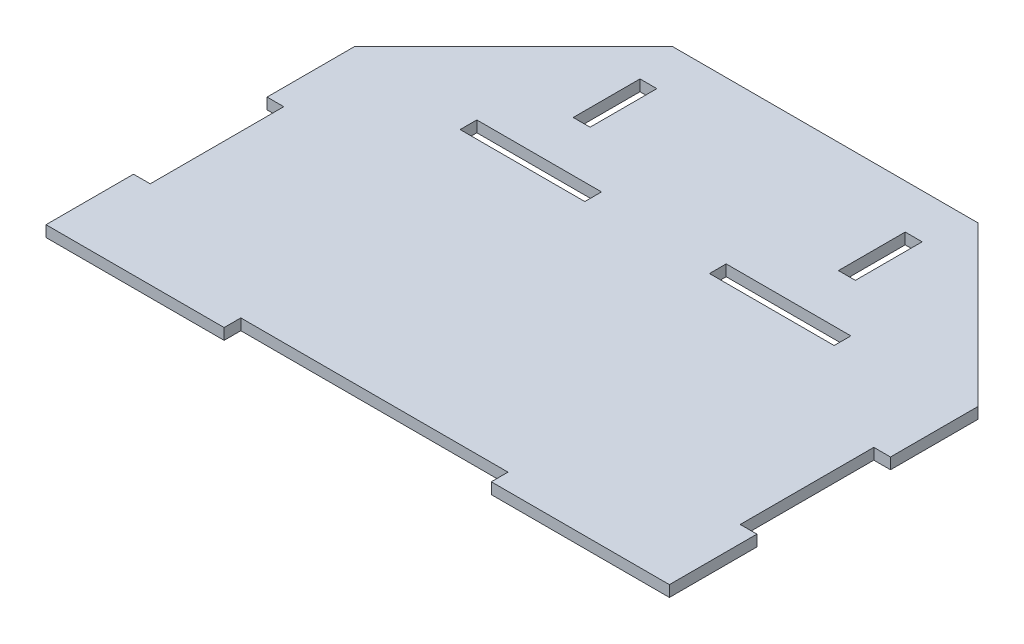
ISO-10303-21;
HEADER;
FILE_DESCRIPTION(('STEP AP214'),'2;1');
FILE_NAME('part.step','',(''),(''),'','','');
FILE_SCHEMA(('AUTOMOTIVE_DESIGN { 1 0 10303 214 1 1 1 1 }'));
ENDSEC;
DATA;
#1=APPLICATION_CONTEXT('core data for automotive mechanical design processes');
#2=APPLICATION_PROTOCOL_DEFINITION('international standard','automotive_design',2000,#1);
#3=PRODUCT_CONTEXT('',#1,'mechanical');
#4=PRODUCT('Part','Part','',(#3));
#5=PRODUCT_RELATED_PRODUCT_CATEGORY('part','',(#4));
#6=PRODUCT_DEFINITION_FORMATION('','',#4);
#7=PRODUCT_DEFINITION_CONTEXT('part definition',#1,'design');
#8=PRODUCT_DEFINITION('design','',#6,#7);
#9=PRODUCT_DEFINITION_SHAPE('','',#8);
#10=(LENGTH_UNIT() NAMED_UNIT(*) SI_UNIT(.MILLI.,.METRE.));
#11=(NAMED_UNIT(*) PLANE_ANGLE_UNIT() SI_UNIT($,.RADIAN.));
#12=(NAMED_UNIT(*) SI_UNIT($,.STERADIAN.) SOLID_ANGLE_UNIT());
#13=UNCERTAINTY_MEASURE_WITH_UNIT(LENGTH_MEASURE(1.E-05),#10,'distance_accuracy_value','');
#14=(GEOMETRIC_REPRESENTATION_CONTEXT(3) GLOBAL_UNCERTAINTY_ASSIGNED_CONTEXT((#13)) GLOBAL_UNIT_ASSIGNED_CONTEXT((#10,
#11,#12)) REPRESENTATION_CONTEXT('',''));
#15=CARTESIAN_POINT('',(0.,0.,0.));
#16=DIRECTION('',(0.,0.,1.));
#17=DIRECTION('',(1.,0.,0.));
#18=AXIS2_PLACEMENT_3D('',#15,#16,#17);
#19=CARTESIAN_POINT('',(-177.8,6.35,0.));
#20=DIRECTION('',(-1.,0.,0.));
#21=DIRECTION('',(0.,0.,1.));
#22=AXIS2_PLACEMENT_3D('',#19,#20,#21);
#23=PLANE('',#22);
#24=DIRECTION('',(0.,0.,-1.));
#25=VECTOR('',#24,1.);
#26=CARTESIAN_POINT('',(-177.8,0.,0.));
#27=LINE('',#26,#25);
#28=CARTESIAN_POINT('',(-177.8,0.,7.23900000000002));
#29=VERTEX_POINT('',#28);
#30=CARTESIAN_POINT('',(-177.8,0.,-42.672));
#31=VERTEX_POINT('',#30);
#32=EDGE_CURVE('E388',#29,#31,#27,.T.);
#33=ORIENTED_EDGE('',*,*,#32,.F.);
#34=DIRECTION('',(0.,-1.,0.));
#35=VECTOR('',#34,1.);
#36=CARTESIAN_POINT('',(-177.8,6.35,7.23900000000002));
#37=LINE('',#36,#35);
#38=CARTESIAN_POINT('',(-177.8,6.35,7.23900000000002));
#39=VERTEX_POINT('',#38);
#40=EDGE_CURVE('E11',#39,#29,#37,.T.);
#41=ORIENTED_EDGE('',*,*,#40,.F.);
#42=DIRECTION('',(0.,0.,-1.));
#43=VECTOR('',#42,1.);
#44=CARTESIAN_POINT('',(-177.8,6.35,0.));
#45=LINE('',#44,#43);
#46=CARTESIAN_POINT('',(-177.8,6.35,-42.672));
#47=VERTEX_POINT('',#46);
#48=EDGE_CURVE('E440',#39,#47,#45,.T.);
#49=ORIENTED_EDGE('',*,*,#48,.T.);
#50=DIRECTION('',(0.,-1.,0.));
#51=VECTOR('',#50,1.);
#52=CARTESIAN_POINT('',(-177.8,6.35,-42.672));
#53=LINE('',#52,#51);
#54=EDGE_CURVE('E503',#47,#31,#53,.T.);
#55=ORIENTED_EDGE('',*,*,#54,.T.);
#56=EDGE_LOOP('',(#33,#41,#49,#55));
#57=FACE_BOUND('',#56,.T.);
#58=ADVANCED_FACE('F38',(#57),#23,.T.);
#59=CARTESIAN_POINT('',(0.,6.35,7.23900000000015));
#60=DIRECTION('',(0.,0.,-1.));
#61=DIRECTION('',(-1.,0.,0.));
#62=AXIS2_PLACEMENT_3D('',#59,#60,#61);
#63=PLANE('',#62);
#64=DIRECTION('',(1.,0.,0.));
#65=VECTOR('',#64,1.);
#66=CARTESIAN_POINT('',(0.,0.,7.23900000000015));
#67=LINE('',#66,#65);
#68=CARTESIAN_POINT('',(-168.275,0.,7.23900000000003));
#69=VERTEX_POINT('',#68);
#70=EDGE_CURVE('E507',#29,#69,#67,.T.);
#71=ORIENTED_EDGE('',*,*,#70,.T.);
#72=DIRECTION('',(0.,-1.,0.));
#73=VECTOR('',#72,1.);
#74=CARTESIAN_POINT('',(-168.275,6.35,7.23900000000003));
#75=LINE('',#74,#73);
#76=CARTESIAN_POINT('',(-168.275,6.35,7.23900000000003));
#77=VERTEX_POINT('',#76);
#78=EDGE_CURVE('E46',#77,#69,#75,.T.);
#79=ORIENTED_EDGE('',*,*,#78,.F.);
#80=DIRECTION('',(1.,0.,0.));
#81=VECTOR('',#80,1.);
#82=CARTESIAN_POINT('',(0.,6.35,7.23900000000015));
#83=LINE('',#82,#81);
#84=EDGE_CURVE('E444',#39,#77,#83,.T.);
#85=ORIENTED_EDGE('',*,*,#84,.F.);
#86=ORIENTED_EDGE('',*,*,#40,.T.);
#87=EDGE_LOOP('',(#71,#79,#85,#86));
#88=FACE_BOUND('',#87,.T.);
#89=ADVANCED_FACE('F629',(#88),#63,.F.);
#90=CARTESIAN_POINT('',(-168.275,6.35,0.));
#91=DIRECTION('',(-1.,0.,0.));
#92=DIRECTION('',(0.,0.,1.));
#93=AXIS2_PLACEMENT_3D('',#90,#91,#92);
#94=PLANE('',#93);
#95=DIRECTION('',(0.,0.,-1.));
#96=VECTOR('',#95,1.);
#97=CARTESIAN_POINT('',(-168.275,0.,0.));
#98=LINE('',#97,#96);
#99=CARTESIAN_POINT('',(-168.275,0.,83.439));
#100=VERTEX_POINT('',#99);
#101=EDGE_CURVE('E511',#100,#69,#98,.T.);
#102=ORIENTED_EDGE('',*,*,#101,.F.);
#103=DIRECTION('',(0.,-1.,0.));
#104=VECTOR('',#103,1.);
#105=CARTESIAN_POINT('',(-168.275,6.35,83.439));
#106=LINE('',#105,#104);
#107=CARTESIAN_POINT('',(-168.275,6.35,83.439));
#108=VERTEX_POINT('',#107);
#109=EDGE_CURVE('E618',#108,#100,#106,.T.);
#110=ORIENTED_EDGE('',*,*,#109,.F.);
#111=DIRECTION('',(0.,0.,-1.));
#112=VECTOR('',#111,1.);
#113=CARTESIAN_POINT('',(-168.275,6.35,0.));
#114=LINE('',#113,#112);
#115=EDGE_CURVE('E448',#108,#77,#114,.T.);
#116=ORIENTED_EDGE('',*,*,#115,.T.);
#117=ORIENTED_EDGE('',*,*,#78,.T.);
#118=EDGE_LOOP('',(#102,#110,#116,#117));
#119=FACE_BOUND('',#118,.T.);
#120=ADVANCED_FACE('F624',(#119),#94,.T.);
#121=CARTESIAN_POINT('',(0.,6.35,83.439));
#122=DIRECTION('',(0.,0.,-1.));
#123=DIRECTION('',(-1.,0.,0.));
#124=AXIS2_PLACEMENT_3D('',#121,#122,#123);
#125=PLANE('',#124);
#126=DIRECTION('',(1.,0.,0.));
#127=VECTOR('',#126,1.);
#128=CARTESIAN_POINT('',(0.,0.,83.439));
#129=LINE('',#128,#127);
#130=CARTESIAN_POINT('',(-177.8,0.,83.439));
#131=VERTEX_POINT('',#130);
#132=EDGE_CURVE('E515',#131,#100,#129,.T.);
#133=ORIENTED_EDGE('',*,*,#132,.F.);
#134=DIRECTION('',(0.,-1.,0.));
#135=VECTOR('',#134,1.);
#136=CARTESIAN_POINT('',(-177.8,6.35,83.439));
#137=LINE('',#136,#135);
#138=CARTESIAN_POINT('',(-177.8,6.35,83.439));
#139=VERTEX_POINT('',#138);
#140=EDGE_CURVE('E615',#139,#131,#137,.T.);
#141=ORIENTED_EDGE('',*,*,#140,.F.);
#142=DIRECTION('',(1.,0.,0.));
#143=VECTOR('',#142,1.);
#144=CARTESIAN_POINT('',(0.,6.35,83.439));
#145=LINE('',#144,#143);
#146=EDGE_CURVE('E452',#139,#108,#145,.T.);
#147=ORIENTED_EDGE('',*,*,#146,.T.);
#148=ORIENTED_EDGE('',*,*,#109,.T.);
#149=EDGE_LOOP('',(#133,#141,#147,#148));
#150=FACE_BOUND('',#149,.T.);
#151=ADVANCED_FACE('F636',(#150),#125,.T.);
#152=CARTESIAN_POINT('',(-177.8,6.35,0.));
#153=DIRECTION('',(-1.,0.,0.));
#154=DIRECTION('',(0.,0.,1.));
#155=AXIS2_PLACEMENT_3D('',#152,#153,#154);
#156=PLANE('',#155);
#157=DIRECTION('',(0.,0.,-1.));
#158=VECTOR('',#157,1.);
#159=CARTESIAN_POINT('',(-177.8,0.,0.));
#160=LINE('',#159,#158);
#161=CARTESIAN_POINT('',(-177.8,0.,133.35));
#162=VERTEX_POINT('',#161);
#163=EDGE_CURVE('E519',#162,#131,#160,.T.);
#164=ORIENTED_EDGE('',*,*,#163,.F.);
#165=DIRECTION('',(0.,-1.,0.));
#166=VECTOR('',#165,1.);
#167=CARTESIAN_POINT('',(-177.8,6.35,133.35));
#168=LINE('',#167,#166);
#169=CARTESIAN_POINT('',(-177.8,6.35,133.35));
#170=VERTEX_POINT('',#169);
#171=EDGE_CURVE('E612',#170,#162,#168,.T.);
#172=ORIENTED_EDGE('',*,*,#171,.F.);
#173=DIRECTION('',(0.,0.,-1.));
#174=VECTOR('',#173,1.);
#175=CARTESIAN_POINT('',(-177.8,6.35,0.));
#176=LINE('',#175,#174);
#177=EDGE_CURVE('E456',#170,#139,#176,.T.);
#178=ORIENTED_EDGE('',*,*,#177,.T.);
#179=ORIENTED_EDGE('',*,*,#140,.T.);
#180=EDGE_LOOP('',(#164,#172,#178,#179));
#181=FACE_BOUND('',#180,.T.);
#182=ADVANCED_FACE('F703',(#181),#156,.T.);
#183=CARTESIAN_POINT('',(0.,6.35,133.35));
#184=DIRECTION('',(0.,0.,-1.));
#185=DIRECTION('',(-1.,0.,0.));
#186=AXIS2_PLACEMENT_3D('',#183,#184,#185);
#187=PLANE('',#186);
#188=DIRECTION('',(1.,0.,0.));
#189=VECTOR('',#188,1.);
#190=CARTESIAN_POINT('',(0.,0.,133.35));
#191=LINE('',#190,#189);
#192=CARTESIAN_POINT('',(-76.2,0.,133.35));
#193=VERTEX_POINT('',#192);
#194=EDGE_CURVE('E523',#162,#193,#191,.T.);
#195=ORIENTED_EDGE('',*,*,#194,.T.);
#196=DIRECTION('',(0.,-1.,0.));
#197=VECTOR('',#196,1.);
#198=CARTESIAN_POINT('',(-76.2,6.35,133.35));
#199=LINE('',#198,#197);
#200=CARTESIAN_POINT('',(-76.2,6.35,133.35));
#201=VERTEX_POINT('',#200);
#202=EDGE_CURVE('E608',#201,#193,#199,.T.);
#203=ORIENTED_EDGE('',*,*,#202,.F.);
#204=DIRECTION('',(1.,0.,0.));
#205=VECTOR('',#204,1.);
#206=CARTESIAN_POINT('',(0.,6.35,133.35));
#207=LINE('',#206,#205);
#208=EDGE_CURVE('E460',#170,#201,#207,.T.);
#209=ORIENTED_EDGE('',*,*,#208,.F.);
#210=ORIENTED_EDGE('',*,*,#171,.T.);
#211=EDGE_LOOP('',(#195,#203,#209,#210));
#212=FACE_BOUND('',#211,.T.);
#213=ADVANCED_FACE('F701',(#212),#187,.F.);
#214=CARTESIAN_POINT('',(-76.2,6.35,0.));
#215=DIRECTION('',(-1.,0.,0.));
#216=DIRECTION('',(0.,0.,1.));
#217=AXIS2_PLACEMENT_3D('',#214,#215,#216);
#218=PLANE('',#217);
#219=DIRECTION('',(0.,0.,-1.));
#220=VECTOR('',#219,1.);
#221=CARTESIAN_POINT('',(-76.2,0.,0.));
#222=LINE('',#221,#220);
#223=CARTESIAN_POINT('',(-76.2,0.,123.825));
#224=VERTEX_POINT('',#223);
#225=EDGE_CURVE('E526',#193,#224,#222,.T.);
#226=ORIENTED_EDGE('',*,*,#225,.T.);
#227=DIRECTION('',(0.,-1.,0.));
#228=VECTOR('',#227,1.);
#229=CARTESIAN_POINT('',(-76.2,6.35,123.825));
#230=LINE('',#229,#228);
#231=CARTESIAN_POINT('',(-76.2,6.35,123.825));
#232=VERTEX_POINT('',#231);
#233=EDGE_CURVE('E604',#232,#224,#230,.T.);
#234=ORIENTED_EDGE('',*,*,#233,.F.);
#235=DIRECTION('',(0.,0.,-1.));
#236=VECTOR('',#235,1.);
#237=CARTESIAN_POINT('',(-76.2,6.35,0.));
#238=LINE('',#237,#236);
#239=EDGE_CURVE('E463',#201,#232,#238,.T.);
#240=ORIENTED_EDGE('',*,*,#239,.F.);
#241=ORIENTED_EDGE('',*,*,#202,.T.);
#242=EDGE_LOOP('',(#226,#234,#240,#241));
#243=FACE_BOUND('',#242,.T.);
#244=ADVANCED_FACE('F696',(#243),#218,.F.);
#245=CARTESIAN_POINT('',(0.,6.35,123.825));
#246=DIRECTION('',(0.,0.,-1.));
#247=DIRECTION('',(-1.,0.,0.));
#248=AXIS2_PLACEMENT_3D('',#245,#246,#247);
#249=PLANE('',#248);
#250=DIRECTION('',(1.,0.,0.));
#251=VECTOR('',#250,1.);
#252=CARTESIAN_POINT('',(0.,0.,123.825));
#253=LINE('',#252,#251);
#254=CARTESIAN_POINT('',(76.2,0.,123.825));
#255=VERTEX_POINT('',#254);
#256=EDGE_CURVE('E529',#224,#255,#253,.T.);
#257=ORIENTED_EDGE('',*,*,#256,.T.);
#258=DIRECTION('',(0.,-1.,0.));
#259=VECTOR('',#258,1.);
#260=CARTESIAN_POINT('',(76.2,6.35,123.825));
#261=LINE('',#260,#259);
#262=CARTESIAN_POINT('',(76.2,6.35,123.825));
#263=VERTEX_POINT('',#262);
#264=EDGE_CURVE('E601',#263,#255,#261,.T.);
#265=ORIENTED_EDGE('',*,*,#264,.F.);
#266=DIRECTION('',(1.,0.,0.));
#267=VECTOR('',#266,1.);
#268=CARTESIAN_POINT('',(0.,6.35,123.825));
#269=LINE('',#268,#267);
#270=EDGE_CURVE('E466',#232,#263,#269,.T.);
#271=ORIENTED_EDGE('',*,*,#270,.F.);
#272=ORIENTED_EDGE('',*,*,#233,.T.);
#273=EDGE_LOOP('',(#257,#265,#271,#272));
#274=FACE_BOUND('',#273,.T.);
#275=ADVANCED_FACE('F692',(#274),#249,.F.);
#276=CARTESIAN_POINT('',(76.2,6.35,0.));
#277=DIRECTION('',(-1.,0.,0.));
#278=DIRECTION('',(0.,0.,1.));
#279=AXIS2_PLACEMENT_3D('',#276,#277,#278);
#280=PLANE('',#279);
#281=DIRECTION('',(0.,0.,-1.));
#282=VECTOR('',#281,1.);
#283=CARTESIAN_POINT('',(76.2,0.,0.));
#284=LINE('',#283,#282);
#285=CARTESIAN_POINT('',(76.2,0.,133.35));
#286=VERTEX_POINT('',#285);
#287=EDGE_CURVE('E533',#286,#255,#284,.T.);
#288=ORIENTED_EDGE('',*,*,#287,.F.);
#289=DIRECTION('',(0.,-1.,0.));
#290=VECTOR('',#289,1.);
#291=CARTESIAN_POINT('',(76.2,6.35,133.35));
#292=LINE('',#291,#290);
#293=CARTESIAN_POINT('',(76.2,6.35,133.35));
#294=VERTEX_POINT('',#293);
#295=EDGE_CURVE('E598',#294,#286,#292,.T.);
#296=ORIENTED_EDGE('',*,*,#295,.F.);
#297=DIRECTION('',(0.,0.,-1.));
#298=VECTOR('',#297,1.);
#299=CARTESIAN_POINT('',(76.2,6.35,0.));
#300=LINE('',#299,#298);
#301=EDGE_CURVE('E469',#294,#263,#300,.T.);
#302=ORIENTED_EDGE('',*,*,#301,.T.);
#303=ORIENTED_EDGE('',*,*,#264,.T.);
#304=EDGE_LOOP('',(#288,#296,#302,#303));
#305=FACE_BOUND('',#304,.T.);
#306=ADVANCED_FACE('F686',(#305),#280,.T.);
#307=CARTESIAN_POINT('',(0.,6.35,133.35));
#308=DIRECTION('',(0.,0.,-1.));
#309=DIRECTION('',(-1.,0.,0.));
#310=AXIS2_PLACEMENT_3D('',#307,#308,#309);
#311=PLANE('',#310);
#312=DIRECTION('',(1.,0.,0.));
#313=VECTOR('',#312,1.);
#314=CARTESIAN_POINT('',(0.,0.,133.35));
#315=LINE('',#314,#313);
#316=CARTESIAN_POINT('',(177.8,0.,133.35));
#317=VERTEX_POINT('',#316);
#318=EDGE_CURVE('E537',#286,#317,#315,.T.);
#319=ORIENTED_EDGE('',*,*,#318,.T.);
#320=DIRECTION('',(0.,-1.,0.));
#321=VECTOR('',#320,1.);
#322=CARTESIAN_POINT('',(177.8,6.35,133.35));
#323=LINE('',#322,#321);
#324=CARTESIAN_POINT('',(177.8,6.35,133.35));
#325=VERTEX_POINT('',#324);
#326=EDGE_CURVE('E594',#325,#317,#323,.T.);
#327=ORIENTED_EDGE('',*,*,#326,.F.);
#328=DIRECTION('',(1.,0.,0.));
#329=VECTOR('',#328,1.);
#330=CARTESIAN_POINT('',(0.,6.35,133.35));
#331=LINE('',#330,#329);
#332=EDGE_CURVE('E473',#294,#325,#331,.T.);
#333=ORIENTED_EDGE('',*,*,#332,.F.);
#334=ORIENTED_EDGE('',*,*,#295,.T.);
#335=EDGE_LOOP('',(#319,#327,#333,#334));
#336=FACE_BOUND('',#335,.T.);
#337=ADVANCED_FACE('F704',(#336),#311,.F.);
#338=CARTESIAN_POINT('',(177.8,6.35,0.));
#339=DIRECTION('',(-1.,0.,0.));
#340=DIRECTION('',(0.,0.,1.));
#341=AXIS2_PLACEMENT_3D('',#338,#339,#340);
#342=PLANE('',#341);
#343=DIRECTION('',(0.,0.,-1.));
#344=VECTOR('',#343,1.);
#345=CARTESIAN_POINT('',(177.8,0.,0.));
#346=LINE('',#345,#344);
#347=CARTESIAN_POINT('',(177.8,0.,83.4390000000001));
#348=VERTEX_POINT('',#347);
#349=EDGE_CURVE('E540',#317,#348,#346,.T.);
#350=ORIENTED_EDGE('',*,*,#349,.T.);
#351=DIRECTION('',(0.,-1.,0.));
#352=VECTOR('',#351,1.);
#353=CARTESIAN_POINT('',(177.8,6.35,83.4390000000001));
#354=LINE('',#353,#352);
#355=CARTESIAN_POINT('',(177.8,6.35,83.4390000000001));
#356=VERTEX_POINT('',#355);
#357=EDGE_CURVE('E590',#356,#348,#354,.T.);
#358=ORIENTED_EDGE('',*,*,#357,.F.);
#359=DIRECTION('',(0.,0.,-1.));
#360=VECTOR('',#359,1.);
#361=CARTESIAN_POINT('',(177.8,6.35,0.));
#362=LINE('',#361,#360);
#363=EDGE_CURVE('E476',#325,#356,#362,.T.);
#364=ORIENTED_EDGE('',*,*,#363,.F.);
#365=ORIENTED_EDGE('',*,*,#326,.T.);
#366=EDGE_LOOP('',(#350,#358,#364,#365));
#367=FACE_BOUND('',#366,.T.);
#368=ADVANCED_FACE('F679',(#367),#342,.F.);
#369=CARTESIAN_POINT('',(0.,6.35,83.4390000000001));
#370=DIRECTION('',(0.,0.,1.));
#371=DIRECTION('',(1.,0.,0.));
#372=AXIS2_PLACEMENT_3D('',#369,#370,#371);
#373=PLANE('',#372);
#374=DIRECTION('',(-1.,0.,0.));
#375=VECTOR('',#374,1.);
#376=CARTESIAN_POINT('',(0.,0.,83.4390000000001));
#377=LINE('',#376,#375);
#378=CARTESIAN_POINT('',(168.275,0.,83.4390000000001));
#379=VERTEX_POINT('',#378);
#380=EDGE_CURVE('E543',#348,#379,#377,.T.);
#381=ORIENTED_EDGE('',*,*,#380,.T.);
#382=DIRECTION('',(0.,-1.,0.));
#383=VECTOR('',#382,1.);
#384=CARTESIAN_POINT('',(168.275,6.35,83.4390000000001));
#385=LINE('',#384,#383);
#386=CARTESIAN_POINT('',(168.275,6.35,83.4390000000001));
#387=VERTEX_POINT('',#386);
#388=EDGE_CURVE('E586',#387,#379,#385,.T.);
#389=ORIENTED_EDGE('',*,*,#388,.F.);
#390=DIRECTION('',(-1.,0.,0.));
#391=VECTOR('',#390,1.);
#392=CARTESIAN_POINT('',(0.,6.35,83.4390000000001));
#393=LINE('',#392,#391);
#394=EDGE_CURVE('E479',#356,#387,#393,.T.);
#395=ORIENTED_EDGE('',*,*,#394,.F.);
#396=ORIENTED_EDGE('',*,*,#357,.T.);
#397=EDGE_LOOP('',(#381,#389,#395,#396));
#398=FACE_BOUND('',#397,.T.);
#399=ADVANCED_FACE('F675',(#398),#373,.F.);
#400=CARTESIAN_POINT('',(168.275,6.35,0.));
#401=DIRECTION('',(-1.,0.,0.));
#402=DIRECTION('',(0.,0.,1.));
#403=AXIS2_PLACEMENT_3D('',#400,#401,#402);
#404=PLANE('',#403);
#405=DIRECTION('',(0.,0.,-1.));
#406=VECTOR('',#405,1.);
#407=CARTESIAN_POINT('',(168.275,0.,0.));
#408=LINE('',#407,#406);
#409=CARTESIAN_POINT('',(168.275,0.,7.23900000000009));
#410=VERTEX_POINT('',#409);
#411=EDGE_CURVE('E546',#379,#410,#408,.T.);
#412=ORIENTED_EDGE('',*,*,#411,.T.);
#413=DIRECTION('',(0.,-1.,0.));
#414=VECTOR('',#413,1.);
#415=CARTESIAN_POINT('',(168.275,6.35,7.23900000000009));
#416=LINE('',#415,#414);
#417=CARTESIAN_POINT('',(168.275,6.35,7.23900000000009));
#418=VERTEX_POINT('',#417);
#419=EDGE_CURVE('E583',#418,#410,#416,.T.);
#420=ORIENTED_EDGE('',*,*,#419,.F.);
#421=DIRECTION('',(0.,0.,-1.));
#422=VECTOR('',#421,1.);
#423=CARTESIAN_POINT('',(168.275,6.35,0.));
#424=LINE('',#423,#422);
#425=EDGE_CURVE('E482',#387,#418,#424,.T.);
#426=ORIENTED_EDGE('',*,*,#425,.F.);
#427=ORIENTED_EDGE('',*,*,#388,.T.);
#428=EDGE_LOOP('',(#412,#420,#426,#427));
#429=FACE_BOUND('',#428,.T.);
#430=ADVANCED_FACE('F670',(#429),#404,.F.);
#431=CARTESIAN_POINT('',(0.,6.35,7.23900000000021));
#432=DIRECTION('',(0.,0.,1.));
#433=DIRECTION('',(1.,0.,0.));
#434=AXIS2_PLACEMENT_3D('',#431,#432,#433);
#435=PLANE('',#434);
#436=DIRECTION('',(-1.,0.,0.));
#437=VECTOR('',#436,1.);
#438=CARTESIAN_POINT('',(0.,0.,7.23900000000021));
#439=LINE('',#438,#437);
#440=CARTESIAN_POINT('',(177.8,0.,7.23900000000008));
#441=VERTEX_POINT('',#440);
#442=EDGE_CURVE('E550',#441,#410,#439,.T.);
#443=ORIENTED_EDGE('',*,*,#442,.F.);
#444=DIRECTION('',(0.,-1.,0.));
#445=VECTOR('',#444,1.);
#446=CARTESIAN_POINT('',(177.8,6.35,7.23900000000008));
#447=LINE('',#446,#445);
#448=CARTESIAN_POINT('',(177.8,6.35,7.23900000000008));
#449=VERTEX_POINT('',#448);
#450=EDGE_CURVE('E580',#449,#441,#447,.T.);
#451=ORIENTED_EDGE('',*,*,#450,.F.);
#452=DIRECTION('',(-1.,0.,0.));
#453=VECTOR('',#452,1.);
#454=CARTESIAN_POINT('',(0.,6.35,7.23900000000021));
#455=LINE('',#454,#453);
#456=EDGE_CURVE('E485',#449,#418,#455,.T.);
#457=ORIENTED_EDGE('',*,*,#456,.T.);
#458=ORIENTED_EDGE('',*,*,#419,.T.);
#459=EDGE_LOOP('',(#443,#451,#457,#458));
#460=FACE_BOUND('',#459,.T.);
#461=ADVANCED_FACE('F664',(#460),#435,.T.);
#462=CARTESIAN_POINT('',(177.8,6.35,0.));
#463=DIRECTION('',(-1.,0.,0.));
#464=DIRECTION('',(0.,0.,1.));
#465=AXIS2_PLACEMENT_3D('',#462,#463,#464);
#466=PLANE('',#465);
#467=DIRECTION('',(0.,0.,-1.));
#468=VECTOR('',#467,1.);
#469=CARTESIAN_POINT('',(177.8,0.,0.));
#470=LINE('',#469,#468);
#471=CARTESIAN_POINT('',(177.8,0.,-42.6719999999999));
#472=VERTEX_POINT('',#471);
#473=EDGE_CURVE('E554',#441,#472,#470,.T.);
#474=ORIENTED_EDGE('',*,*,#473,.T.);
#475=DIRECTION('',(0.,-1.,0.));
#476=VECTOR('',#475,1.);
#477=CARTESIAN_POINT('',(177.8,6.35,-42.6719999999999));
#478=LINE('',#477,#476);
#479=CARTESIAN_POINT('',(177.8,6.35,-42.6719999999999));
#480=VERTEX_POINT('',#479);
#481=EDGE_CURVE('E576',#480,#472,#478,.T.);
#482=ORIENTED_EDGE('',*,*,#481,.F.);
#483=DIRECTION('',(0.,0.,-1.));
#484=VECTOR('',#483,1.);
#485=CARTESIAN_POINT('',(177.8,6.35,0.));
#486=LINE('',#485,#484);
#487=EDGE_CURVE('E489',#449,#480,#486,.T.);
#488=ORIENTED_EDGE('',*,*,#487,.F.);
#489=ORIENTED_EDGE('',*,*,#450,.T.);
#490=EDGE_LOOP('',(#474,#482,#488,#489));
#491=FACE_BOUND('',#490,.T.);
#492=ADVANCED_FACE('F661',(#491),#466,.F.);
#493=CARTESIAN_POINT('',(110.236,6.35,-110.236));
#494=DIRECTION('',(-0.707106781186547,0.,0.707106781186548));
#495=DIRECTION('',(0.707106781186548,0.,0.707106781186547));
#496=AXIS2_PLACEMENT_3D('',#493,#494,#495);
#497=PLANE('',#496);
#498=DIRECTION('',(-0.707106781186548,0.,-0.707106781186547));
#499=VECTOR('',#498,1.);
#500=CARTESIAN_POINT('',(110.236,0.,-110.236));
#501=LINE('',#500,#499);
#502=CARTESIAN_POINT('',(87.122,0.,-133.35));
#503=VERTEX_POINT('',#502);
#504=EDGE_CURVE('E557',#472,#503,#501,.T.);
#505=ORIENTED_EDGE('',*,*,#504,.T.);
#506=DIRECTION('',(0.,-1.,0.));
#507=VECTOR('',#506,1.);
#508=CARTESIAN_POINT('',(87.122,6.35,-133.35));
#509=LINE('',#508,#507);
#510=CARTESIAN_POINT('',(87.122,6.35,-133.35));
#511=VERTEX_POINT('',#510);
#512=EDGE_CURVE('E573',#511,#503,#509,.T.);
#513=ORIENTED_EDGE('',*,*,#512,.F.);
#514=DIRECTION('',(-0.707106781186548,0.,-0.707106781186547));
#515=VECTOR('',#514,1.);
#516=CARTESIAN_POINT('',(110.236,6.35,-110.236));
#517=LINE('',#516,#515);
#518=EDGE_CURVE('E492',#480,#511,#517,.T.);
#519=ORIENTED_EDGE('',*,*,#518,.F.);
#520=ORIENTED_EDGE('',*,*,#481,.T.);
#521=EDGE_LOOP('',(#505,#513,#519,#520));
#522=FACE_BOUND('',#521,.T.);
#523=ADVANCED_FACE('F656',(#522),#497,.F.);
#524=CARTESIAN_POINT('',(0.,6.35,-133.35));
#525=DIRECTION('',(0.,0.,-1.));
#526=DIRECTION('',(-1.,0.,0.));
#527=AXIS2_PLACEMENT_3D('',#524,#525,#526);
#528=PLANE('',#527);
#529=DIRECTION('',(1.,0.,0.));
#530=VECTOR('',#529,1.);
#531=CARTESIAN_POINT('',(0.,0.,-133.35));
#532=LINE('',#531,#530);
#533=CARTESIAN_POINT('',(-87.122,0.,-133.35));
#534=VERTEX_POINT('',#533);
#535=EDGE_CURVE('E561',#534,#503,#532,.T.);
#536=ORIENTED_EDGE('',*,*,#535,.F.);
#537=DIRECTION('',(0.,-1.,0.));
#538=VECTOR('',#537,1.);
#539=CARTESIAN_POINT('',(-87.122,6.35,-133.35));
#540=LINE('',#539,#538);
#541=CARTESIAN_POINT('',(-87.122,6.35,-133.35));
#542=VERTEX_POINT('',#541);
#543=EDGE_CURVE('E570',#542,#534,#540,.T.);
#544=ORIENTED_EDGE('',*,*,#543,.F.);
#545=DIRECTION('',(1.,0.,0.));
#546=VECTOR('',#545,1.);
#547=CARTESIAN_POINT('',(0.,6.35,-133.35));
#548=LINE('',#547,#546);
#549=EDGE_CURVE('E495',#542,#511,#548,.T.);
#550=ORIENTED_EDGE('',*,*,#549,.T.);
#551=ORIENTED_EDGE('',*,*,#512,.T.);
#552=EDGE_LOOP('',(#536,#544,#550,#551));
#553=FACE_BOUND('',#552,.T.);
#554=ADVANCED_FACE('F650',(#553),#528,.T.);
#555=CARTESIAN_POINT('',(-110.236,6.35,-110.236));
#556=DIRECTION('',(-0.707106781186547,0.,-0.707106781186548));
#557=DIRECTION('',(-0.707106781186548,0.,0.707106781186547));
#558=AXIS2_PLACEMENT_3D('',#555,#556,#557);
#559=PLANE('',#558);
#560=DIRECTION('',(0.707106781186548,0.,-0.707106781186547));
#561=VECTOR('',#560,1.);
#562=CARTESIAN_POINT('',(-110.236,0.,-110.236));
#563=LINE('',#562,#561);
#564=EDGE_CURVE('E445',#31,#534,#563,.T.);
#565=ORIENTED_EDGE('',*,*,#564,.F.);
#566=ORIENTED_EDGE('',*,*,#54,.F.);
#567=DIRECTION('',(0.707106781186548,0.,-0.707106781186547));
#568=VECTOR('',#567,1.);
#569=CARTESIAN_POINT('',(-110.236,6.35,-110.236));
#570=LINE('',#569,#568);
#571=EDGE_CURVE('E499',#47,#542,#570,.T.);
#572=ORIENTED_EDGE('',*,*,#571,.T.);
#573=ORIENTED_EDGE('',*,*,#543,.T.);
#574=EDGE_LOOP('',(#565,#566,#572,#573));
#575=FACE_BOUND('',#574,.T.);
#576=ADVANCED_FACE('F647',(#575),#559,.T.);
#577=CARTESIAN_POINT('',(0.,6.35,0.));
#578=DIRECTION('',(0.,1.,0.));
#579=DIRECTION('',(0.,0.,1.));
#580=AXIS2_PLACEMENT_3D('',#577,#578,#579);
#581=PLANE('',#580);
#582=DIRECTION('',(0.,0.,-1.));
#583=VECTOR('',#582,1.);
#584=CARTESIAN_POINT('',(80.5288405685259,6.35,-69.977));
#585=LINE('',#584,#583);
#586=CARTESIAN_POINT('',(80.5288405685259,6.35,-69.977));
#587=VERTEX_POINT('',#586);
#588=CARTESIAN_POINT('',(80.5288405685259,6.35,-108.077));
#589=VERTEX_POINT('',#588);
#590=EDGE_CURVE('E53',#587,#589,#585,.T.);
#591=ORIENTED_EDGE('',*,*,#590,.F.);
#592=DIRECTION('',(1.,0.,0.));
#593=VECTOR('',#592,1.);
#594=CARTESIAN_POINT('',(80.5288405685259,6.35,-69.977));
#595=LINE('',#594,#593);
#596=CARTESIAN_POINT('',(70.8768405685259,6.35,-69.977));
#597=VERTEX_POINT('',#596);
#598=EDGE_CURVE('E282',#597,#587,#595,.T.);
#599=ORIENTED_EDGE('',*,*,#598,.F.);
#600=DIRECTION('',(0.,0.,1.));
#601=VECTOR('',#600,1.);
#602=CARTESIAN_POINT('',(70.8768405685259,6.35,-69.977));
#603=LINE('',#602,#601);
#604=CARTESIAN_POINT('',(70.8768405685259,6.35,-108.077));
#605=VERTEX_POINT('',#604);
#606=EDGE_CURVE('E286',#605,#597,#603,.T.);
#607=ORIENTED_EDGE('',*,*,#606,.F.);
#608=DIRECTION('',(-1.,0.,0.));
#609=VECTOR('',#608,1.);
#610=CARTESIAN_POINT('',(80.5288405685259,6.35,-108.077));
#611=LINE('',#610,#609);
#612=EDGE_CURVE('E295',#589,#605,#611,.T.);
#613=ORIENTED_EDGE('',*,*,#612,.F.);
#614=EDGE_LOOP('',(#591,#599,#607,#613));
#615=FACE_BOUND('',#614,.T.);
#616=DIRECTION('',(0.,0.,1.));
#617=VECTOR('',#616,1.);
#618=CARTESIAN_POINT('',(-80.4077259609515,6.35,-69.977));
#619=LINE('',#618,#617);
#620=CARTESIAN_POINT('',(-80.4077259609515,6.35,-108.077));
#621=VERTEX_POINT('',#620);
#622=CARTESIAN_POINT('',(-80.4077259609515,6.35,-69.977));
#623=VERTEX_POINT('',#622);
#624=EDGE_CURVE('E61',#621,#623,#619,.T.);
#625=ORIENTED_EDGE('',*,*,#624,.F.);
#626=DIRECTION('',(-1.,0.,0.));
#627=VECTOR('',#626,1.);
#628=CARTESIAN_POINT('',(-80.4077259609515,6.35,-108.077));
#629=LINE('',#628,#627);
#630=CARTESIAN_POINT('',(-70.7862581408762,6.35,-108.077));
#631=VERTEX_POINT('',#630);
#632=EDGE_CURVE('E316',#631,#621,#629,.T.);
#633=ORIENTED_EDGE('',*,*,#632,.F.);
#634=DIRECTION('',(0.,0.,-1.));
#635=VECTOR('',#634,1.);
#636=CARTESIAN_POINT('',(-70.7862581408762,6.35,-69.977));
#637=LINE('',#636,#635);
#638=CARTESIAN_POINT('',(-70.7862581408762,6.35,-69.977));
#639=VERTEX_POINT('',#638);
#640=EDGE_CURVE('E335',#639,#631,#637,.T.);
#641=ORIENTED_EDGE('',*,*,#640,.F.);
#642=DIRECTION('',(1.,0.,0.));
#643=VECTOR('',#642,1.);
#644=CARTESIAN_POINT('',(-80.4077259609515,6.35,-69.977));
#645=LINE('',#644,#643);
#646=EDGE_CURVE('E331',#623,#639,#645,.T.);
#647=ORIENTED_EDGE('',*,*,#646,.F.);
#648=EDGE_LOOP('',(#625,#633,#641,#647));
#649=FACE_BOUND('',#648,.T.);
#650=DIRECTION('',(0.,0.,-1.));
#651=VECTOR('',#650,1.);
#652=CARTESIAN_POINT('',(106.68,6.35,-41.275));
#653=LINE('',#652,#651);
#654=CARTESIAN_POINT('',(106.68,6.35,-31.75));
#655=VERTEX_POINT('',#654);
#656=CARTESIAN_POINT('',(106.68,6.35,-41.275));
#657=VERTEX_POINT('',#656);
#658=EDGE_CURVE('E370',#655,#657,#653,.T.);
#659=ORIENTED_EDGE('',*,*,#658,.F.);
#660=DIRECTION('',(1.,0.,0.));
#661=VECTOR('',#660,1.);
#662=CARTESIAN_POINT('',(106.68,6.35,-31.75));
#663=LINE('',#662,#661);
#664=CARTESIAN_POINT('',(35.56,6.35,-31.75));
#665=VERTEX_POINT('',#664);
#666=EDGE_CURVE('E357',#665,#655,#663,.T.);
#667=ORIENTED_EDGE('',*,*,#666,.F.);
#668=DIRECTION('',(0.,0.,1.));
#669=VECTOR('',#668,1.);
#670=CARTESIAN_POINT('',(35.56,6.35,-41.275));
#671=LINE('',#670,#669);
#672=CARTESIAN_POINT('',(35.56,6.35,-41.275));
#673=VERTEX_POINT('',#672);
#674=EDGE_CURVE('E378',#673,#665,#671,.T.);
#675=ORIENTED_EDGE('',*,*,#674,.F.);
#676=DIRECTION('',(-1.,0.,0.));
#677=VECTOR('',#676,1.);
#678=CARTESIAN_POINT('',(106.68,6.35,-41.275));
#679=LINE('',#678,#677);
#680=EDGE_CURVE('E373',#657,#673,#679,.T.);
#681=ORIENTED_EDGE('',*,*,#680,.F.);
#682=EDGE_LOOP('',(#659,#667,#675,#681));
#683=FACE_BOUND('',#682,.T.);
#684=DIRECTION('',(-1.,0.,0.));
#685=VECTOR('',#684,1.);
#686=CARTESIAN_POINT('',(-106.68,6.35,-41.275));
#687=LINE('',#686,#685);
#688=CARTESIAN_POINT('',(-35.56,6.35,-41.275));
#689=VERTEX_POINT('',#688);
#690=CARTESIAN_POINT('',(-106.68,6.35,-41.275));
#691=VERTEX_POINT('',#690);
#692=EDGE_CURVE('E305',#689,#691,#687,.T.);
#693=ORIENTED_EDGE('',*,*,#692,.F.);
#694=DIRECTION('',(0.,0.,-1.));
#695=VECTOR('',#694,1.);
#696=CARTESIAN_POINT('',(-35.56,6.35,-41.275));
#697=LINE('',#696,#695);
#698=CARTESIAN_POINT('',(-35.56,6.35,-31.75));
#699=VERTEX_POINT('',#698);
#700=EDGE_CURVE('E403',#699,#689,#697,.T.);
#701=ORIENTED_EDGE('',*,*,#700,.F.);
#702=DIRECTION('',(1.,0.,0.));
#703=VECTOR('',#702,1.);
#704=CARTESIAN_POINT('',(-106.68,6.35,-31.75));
#705=LINE('',#704,#703);
#706=CARTESIAN_POINT('',(-106.68,6.35,-31.75));
#707=VERTEX_POINT('',#706);
#708=EDGE_CURVE('E422',#707,#699,#705,.T.);
#709=ORIENTED_EDGE('',*,*,#708,.F.);
#710=DIRECTION('',(0.,0.,1.));
#711=VECTOR('',#710,1.);
#712=CARTESIAN_POINT('',(-106.68,6.35,-41.275));
#713=LINE('',#712,#711);
#714=EDGE_CURVE('E418',#691,#707,#713,.T.);
#715=ORIENTED_EDGE('',*,*,#714,.F.);
#716=EDGE_LOOP('',(#693,#701,#709,#715));
#717=FACE_BOUND('',#716,.T.);
#718=ORIENTED_EDGE('',*,*,#48,.F.);
#719=ORIENTED_EDGE('',*,*,#84,.T.);
#720=ORIENTED_EDGE('',*,*,#115,.F.);
#721=ORIENTED_EDGE('',*,*,#146,.F.);
#722=ORIENTED_EDGE('',*,*,#177,.F.);
#723=ORIENTED_EDGE('',*,*,#208,.T.);
#724=ORIENTED_EDGE('',*,*,#239,.T.);
#725=ORIENTED_EDGE('',*,*,#270,.T.);
#726=ORIENTED_EDGE('',*,*,#301,.F.);
#727=ORIENTED_EDGE('',*,*,#332,.T.);
#728=ORIENTED_EDGE('',*,*,#363,.T.);
#729=ORIENTED_EDGE('',*,*,#394,.T.);
#730=ORIENTED_EDGE('',*,*,#425,.T.);
#731=ORIENTED_EDGE('',*,*,#456,.F.);
#732=ORIENTED_EDGE('',*,*,#487,.T.);
#733=ORIENTED_EDGE('',*,*,#518,.T.);
#734=ORIENTED_EDGE('',*,*,#549,.F.);
#735=ORIENTED_EDGE('',*,*,#571,.F.);
#736=EDGE_LOOP('',(#718,#719,#720,#721,#722,#723,#724,#725,#726,#727,#728,#729,#730,#731,#732,
#733,#734,#735));
#737=FACE_BOUND('',#736,.T.);
#738=ADVANCED_FACE('F640',(#615,#649,#683,#717,#737),#581,.T.);
#739=CARTESIAN_POINT('',(0.,0.,0.));
#740=DIRECTION('',(0.,1.,0.));
#741=DIRECTION('',(0.,0.,1.));
#742=AXIS2_PLACEMENT_3D('',#739,#740,#741);
#743=PLANE('',#742);
#744=DIRECTION('',(1.,0.,0.));
#745=VECTOR('',#744,1.);
#746=CARTESIAN_POINT('',(80.5288405685259,0.,-69.977));
#747=LINE('',#746,#745);
#748=CARTESIAN_POINT('',(70.8768405685259,0.,-69.977));
#749=VERTEX_POINT('',#748);
#750=CARTESIAN_POINT('',(80.5288405685259,0.,-69.977));
#751=VERTEX_POINT('',#750);
#752=EDGE_CURVE('E267',#749,#751,#747,.T.);
#753=ORIENTED_EDGE('',*,*,#752,.T.);
#754=DIRECTION('',(0.,0.,-1.));
#755=VECTOR('',#754,1.);
#756=CARTESIAN_POINT('',(80.5288405685259,0.,-69.977));
#757=LINE('',#756,#755);
#758=CARTESIAN_POINT('',(80.5288405685259,0.,-108.077));
#759=VERTEX_POINT('',#758);
#760=EDGE_CURVE('E260',#751,#759,#757,.T.);
#761=ORIENTED_EDGE('',*,*,#760,.T.);
#762=DIRECTION('',(-1.,0.,0.));
#763=VECTOR('',#762,1.);
#764=CARTESIAN_POINT('',(80.5288405685259,0.,-108.077));
#765=LINE('',#764,#763);
#766=CARTESIAN_POINT('',(70.8768405685259,0.,-108.077));
#767=VERTEX_POINT('',#766);
#768=EDGE_CURVE('E271',#759,#767,#765,.T.);
#769=ORIENTED_EDGE('',*,*,#768,.T.);
#770=DIRECTION('',(0.,0.,1.));
#771=VECTOR('',#770,1.);
#772=CARTESIAN_POINT('',(70.8768405685259,0.,-69.977));
#773=LINE('',#772,#771);
#774=EDGE_CURVE('E276',#767,#749,#773,.T.);
#775=ORIENTED_EDGE('',*,*,#774,.T.);
#776=EDGE_LOOP('',(#753,#761,#769,#775));
#777=FACE_BOUND('',#776,.T.);
#778=DIRECTION('',(-1.,0.,0.));
#779=VECTOR('',#778,1.);
#780=CARTESIAN_POINT('',(-80.4077259609515,0.,-108.077));
#781=LINE('',#780,#779);
#782=CARTESIAN_POINT('',(-70.7862581408762,0.,-108.077));
#783=VERTEX_POINT('',#782);
#784=CARTESIAN_POINT('',(-80.4077259609515,0.,-108.077));
#785=VERTEX_POINT('',#784);
#786=EDGE_CURVE('E324',#783,#785,#781,.T.);
#787=ORIENTED_EDGE('',*,*,#786,.T.);
#788=DIRECTION('',(0.,0.,1.));
#789=VECTOR('',#788,1.);
#790=CARTESIAN_POINT('',(-80.4077259609515,0.,-69.977));
#791=LINE('',#790,#789);
#792=CARTESIAN_POINT('',(-80.4077259609515,0.,-69.977));
#793=VERTEX_POINT('',#792);
#794=EDGE_CURVE('E311',#785,#793,#791,.T.);
#795=ORIENTED_EDGE('',*,*,#794,.T.);
#796=DIRECTION('',(1.,0.,0.));
#797=VECTOR('',#796,1.);
#798=CARTESIAN_POINT('',(-80.4077259609515,0.,-69.977));
#799=LINE('',#798,#797);
#800=CARTESIAN_POINT('',(-70.7862581408762,0.,-69.977));
#801=VERTEX_POINT('',#800);
#802=EDGE_CURVE('E315',#793,#801,#799,.T.);
#803=ORIENTED_EDGE('',*,*,#802,.T.);
#804=DIRECTION('',(0.,0.,-1.));
#805=VECTOR('',#804,1.);
#806=CARTESIAN_POINT('',(-70.7862581408762,0.,-69.977));
#807=LINE('',#806,#805);
#808=EDGE_CURVE('E320',#801,#783,#807,.T.);
#809=ORIENTED_EDGE('',*,*,#808,.T.);
#810=EDGE_LOOP('',(#787,#795,#803,#809));
#811=FACE_BOUND('',#810,.T.);
#812=DIRECTION('',(1.,0.,0.));
#813=VECTOR('',#812,1.);
#814=CARTESIAN_POINT('',(106.68,0.,-31.75));
#815=LINE('',#814,#813);
#816=CARTESIAN_POINT('',(35.56,0.,-31.75));
#817=VERTEX_POINT('',#816);
#818=CARTESIAN_POINT('',(106.68,0.,-31.75));
#819=VERTEX_POINT('',#818);
#820=EDGE_CURVE('E365',#817,#819,#815,.T.);
#821=ORIENTED_EDGE('',*,*,#820,.T.);
#822=DIRECTION('',(0.,0.,-1.));
#823=VECTOR('',#822,1.);
#824=CARTESIAN_POINT('',(106.68,0.,-41.275));
#825=LINE('',#824,#823);
#826=CARTESIAN_POINT('',(106.68,0.,-41.275));
#827=VERTEX_POINT('',#826);
#828=EDGE_CURVE('E352',#819,#827,#825,.T.);
#829=ORIENTED_EDGE('',*,*,#828,.T.);
#830=DIRECTION('',(-1.,0.,0.));
#831=VECTOR('',#830,1.);
#832=CARTESIAN_POINT('',(106.68,0.,-41.275));
#833=LINE('',#832,#831);
#834=CARTESIAN_POINT('',(35.56,0.,-41.275));
#835=VERTEX_POINT('',#834);
#836=EDGE_CURVE('E356',#827,#835,#833,.T.);
#837=ORIENTED_EDGE('',*,*,#836,.T.);
#838=DIRECTION('',(0.,0.,1.));
#839=VECTOR('',#838,1.);
#840=CARTESIAN_POINT('',(35.56,0.,-41.275));
#841=LINE('',#840,#839);
#842=EDGE_CURVE('E361',#835,#817,#841,.T.);
#843=ORIENTED_EDGE('',*,*,#842,.T.);
#844=EDGE_LOOP('',(#821,#829,#837,#843));
#845=FACE_BOUND('',#844,.T.);
#846=DIRECTION('',(0.,0.,-1.));
#847=VECTOR('',#846,1.);
#848=CARTESIAN_POINT('',(-35.56,0.,-41.275));
#849=LINE('',#848,#847);
#850=CARTESIAN_POINT('',(-35.56,0.,-31.75));
#851=VERTEX_POINT('',#850);
#852=CARTESIAN_POINT('',(-35.56,0.,-41.275));
#853=VERTEX_POINT('',#852);
#854=EDGE_CURVE('E411',#851,#853,#849,.T.);
#855=ORIENTED_EDGE('',*,*,#854,.T.);
#856=DIRECTION('',(-1.,0.,0.));
#857=VECTOR('',#856,1.);
#858=CARTESIAN_POINT('',(-106.68,0.,-41.275));
#859=LINE('',#858,#857);
#860=CARTESIAN_POINT('',(-106.68,0.,-41.275));
#861=VERTEX_POINT('',#860);
#862=EDGE_CURVE('E398',#853,#861,#859,.T.);
#863=ORIENTED_EDGE('',*,*,#862,.T.);
#864=DIRECTION('',(0.,0.,1.));
#865=VECTOR('',#864,1.);
#866=CARTESIAN_POINT('',(-106.68,0.,-41.275));
#867=LINE('',#866,#865);
#868=CARTESIAN_POINT('',(-106.68,0.,-31.75));
#869=VERTEX_POINT('',#868);
#870=EDGE_CURVE('E402',#861,#869,#867,.T.);
#871=ORIENTED_EDGE('',*,*,#870,.T.);
#872=DIRECTION('',(1.,0.,0.));
#873=VECTOR('',#872,1.);
#874=CARTESIAN_POINT('',(-106.68,0.,-31.75));
#875=LINE('',#874,#873);
#876=EDGE_CURVE('E407',#869,#851,#875,.T.);
#877=ORIENTED_EDGE('',*,*,#876,.T.);
#878=EDGE_LOOP('',(#855,#863,#871,#877));
#879=FACE_BOUND('',#878,.T.);
#880=ORIENTED_EDGE('',*,*,#32,.T.);
#881=ORIENTED_EDGE('',*,*,#564,.T.);
#882=ORIENTED_EDGE('',*,*,#535,.T.);
#883=ORIENTED_EDGE('',*,*,#504,.F.);
#884=ORIENTED_EDGE('',*,*,#473,.F.);
#885=ORIENTED_EDGE('',*,*,#442,.T.);
#886=ORIENTED_EDGE('',*,*,#411,.F.);
#887=ORIENTED_EDGE('',*,*,#380,.F.);
#888=ORIENTED_EDGE('',*,*,#349,.F.);
#889=ORIENTED_EDGE('',*,*,#318,.F.);
#890=ORIENTED_EDGE('',*,*,#287,.T.);
#891=ORIENTED_EDGE('',*,*,#256,.F.);
#892=ORIENTED_EDGE('',*,*,#225,.F.);
#893=ORIENTED_EDGE('',*,*,#194,.F.);
#894=ORIENTED_EDGE('',*,*,#163,.T.);
#895=ORIENTED_EDGE('',*,*,#132,.T.);
#896=ORIENTED_EDGE('',*,*,#101,.T.);
#897=ORIENTED_EDGE('',*,*,#70,.F.);
#898=EDGE_LOOP('',(#880,#881,#882,#883,#884,#885,#886,#887,#888,#889,#890,#891,#892,#893,#894,
#895,#896,#897));
#899=FACE_BOUND('',#898,.T.);
#900=ADVANCED_FACE('F278',(#777,#811,#845,#879,#899),#743,.F.);
#901=CARTESIAN_POINT('',(-106.68,0.,-41.275));
#902=DIRECTION('',(0.,0.,-1.));
#903=DIRECTION('',(-1.,0.,0.));
#904=AXIS2_PLACEMENT_3D('',#901,#902,#903);
#905=PLANE('',#904);
#906=ORIENTED_EDGE('',*,*,#692,.T.);
#907=DIRECTION('',(0.,1.,0.));
#908=VECTOR('',#907,1.);
#909=CARTESIAN_POINT('',(-106.68,0.,-41.275));
#910=LINE('',#909,#908);
#911=EDGE_CURVE('E415',#861,#691,#910,.T.);
#912=ORIENTED_EDGE('',*,*,#911,.F.);
#913=ORIENTED_EDGE('',*,*,#862,.F.);
#914=DIRECTION('',(0.,1.,0.));
#915=VECTOR('',#914,1.);
#916=CARTESIAN_POINT('',(-35.56,0.,-41.275));
#917=LINE('',#916,#915);
#918=EDGE_CURVE('E374',#853,#689,#917,.T.);
#919=ORIENTED_EDGE('',*,*,#918,.T.);
#920=EDGE_LOOP('',(#906,#912,#913,#919));
#921=FACE_BOUND('',#920,.T.);
#922=ADVANCED_FACE('F813',(#921),#905,.F.);
#923=CARTESIAN_POINT('',(-35.56,0.,-41.275));
#924=DIRECTION('',(1.,0.,0.));
#925=DIRECTION('',(0.,0.,-1.));
#926=AXIS2_PLACEMENT_3D('',#923,#924,#925);
#927=PLANE('',#926);
#928=ORIENTED_EDGE('',*,*,#700,.T.);
#929=ORIENTED_EDGE('',*,*,#918,.F.);
#930=ORIENTED_EDGE('',*,*,#854,.F.);
#931=DIRECTION('',(0.,1.,0.));
#932=VECTOR('',#931,1.);
#933=CARTESIAN_POINT('',(-35.56,0.,-31.75));
#934=LINE('',#933,#932);
#935=EDGE_CURVE('E431',#851,#699,#934,.T.);
#936=ORIENTED_EDGE('',*,*,#935,.T.);
#937=EDGE_LOOP('',(#928,#929,#930,#936));
#938=FACE_BOUND('',#937,.T.);
#939=ADVANCED_FACE('F818',(#938),#927,.F.);
#940=CARTESIAN_POINT('',(-106.68,0.,-31.75));
#941=DIRECTION('',(0.,0.,1.));
#942=DIRECTION('',(1.,0.,0.));
#943=AXIS2_PLACEMENT_3D('',#940,#941,#942);
#944=PLANE('',#943);
#945=ORIENTED_EDGE('',*,*,#708,.T.);
#946=ORIENTED_EDGE('',*,*,#935,.F.);
#947=ORIENTED_EDGE('',*,*,#876,.F.);
#948=DIRECTION('',(0.,1.,0.));
#949=VECTOR('',#948,1.);
#950=CARTESIAN_POINT('',(-106.68,0.,-31.75));
#951=LINE('',#950,#949);
#952=EDGE_CURVE('E434',#869,#707,#951,.T.);
#953=ORIENTED_EDGE('',*,*,#952,.T.);
#954=EDGE_LOOP('',(#945,#946,#947,#953));
#955=FACE_BOUND('',#954,.T.);
#956=ADVANCED_FACE('F830',(#955),#944,.F.);
#957=CARTESIAN_POINT('',(-106.68,0.,-41.275));
#958=DIRECTION('',(-1.,0.,0.));
#959=DIRECTION('',(0.,0.,1.));
#960=AXIS2_PLACEMENT_3D('',#957,#958,#959);
#961=PLANE('',#960);
#962=ORIENTED_EDGE('',*,*,#714,.T.);
#963=ORIENTED_EDGE('',*,*,#952,.F.);
#964=ORIENTED_EDGE('',*,*,#870,.F.);
#965=ORIENTED_EDGE('',*,*,#911,.T.);
#966=EDGE_LOOP('',(#962,#963,#964,#965));
#967=FACE_BOUND('',#966,.T.);
#968=ADVANCED_FACE('F840',(#967),#961,.F.);
#969=CARTESIAN_POINT('',(106.68,0.,-41.275));
#970=DIRECTION('',(1.,0.,0.));
#971=DIRECTION('',(0.,0.,-1.));
#972=AXIS2_PLACEMENT_3D('',#969,#970,#971);
#973=PLANE('',#972);
#974=ORIENTED_EDGE('',*,*,#658,.T.);
#975=DIRECTION('',(0.,1.,0.));
#976=VECTOR('',#975,1.);
#977=CARTESIAN_POINT('',(106.68,0.,-41.275));
#978=LINE('',#977,#976);
#979=EDGE_CURVE('E369',#827,#657,#978,.T.);
#980=ORIENTED_EDGE('',*,*,#979,.F.);
#981=ORIENTED_EDGE('',*,*,#828,.F.);
#982=DIRECTION('',(0.,1.,0.));
#983=VECTOR('',#982,1.);
#984=CARTESIAN_POINT('',(106.68,0.,-31.75));
#985=LINE('',#984,#983);
#986=EDGE_CURVE('E385',#819,#655,#985,.T.);
#987=ORIENTED_EDGE('',*,*,#986,.T.);
#988=EDGE_LOOP('',(#974,#980,#981,#987));
#989=FACE_BOUND('',#988,.T.);
#990=ADVANCED_FACE('F850',(#989),#973,.F.);
#991=CARTESIAN_POINT('',(106.68,0.,-31.75));
#992=DIRECTION('',(0.,0.,1.));
#993=DIRECTION('',(1.,0.,0.));
#994=AXIS2_PLACEMENT_3D('',#991,#992,#993);
#995=PLANE('',#994);
#996=ORIENTED_EDGE('',*,*,#666,.T.);
#997=ORIENTED_EDGE('',*,*,#986,.F.);
#998=ORIENTED_EDGE('',*,*,#820,.F.);
#999=DIRECTION('',(0.,1.,0.));
#1000=VECTOR('',#999,1.);
#1001=CARTESIAN_POINT('',(35.56,0.,-31.75));
#1002=LINE('',#1001,#1000);
#1003=EDGE_CURVE('E389',#817,#665,#1002,.T.);
#1004=ORIENTED_EDGE('',*,*,#1003,.T.);
#1005=EDGE_LOOP('',(#996,#997,#998,#1004));
#1006=FACE_BOUND('',#1005,.T.);
#1007=ADVANCED_FACE('F860',(#1006),#995,.F.);
#1008=CARTESIAN_POINT('',(35.56,0.,-41.275));
#1009=DIRECTION('',(-1.,0.,0.));
#1010=DIRECTION('',(0.,0.,1.));
#1011=AXIS2_PLACEMENT_3D('',#1008,#1009,#1010);
#1012=PLANE('',#1011);
#1013=ORIENTED_EDGE('',*,*,#674,.T.);
#1014=ORIENTED_EDGE('',*,*,#1003,.F.);
#1015=ORIENTED_EDGE('',*,*,#842,.F.);
#1016=DIRECTION('',(0.,1.,0.));
#1017=VECTOR('',#1016,1.);
#1018=CARTESIAN_POINT('',(35.56,0.,-41.275));
#1019=LINE('',#1018,#1017);
#1020=EDGE_CURVE('E392',#835,#673,#1019,.T.);
#1021=ORIENTED_EDGE('',*,*,#1020,.T.);
#1022=EDGE_LOOP('',(#1013,#1014,#1015,#1021));
#1023=FACE_BOUND('',#1022,.T.);
#1024=ADVANCED_FACE('F870',(#1023),#1012,.F.);
#1025=CARTESIAN_POINT('',(106.68,0.,-41.275));
#1026=DIRECTION('',(0.,0.,-1.));
#1027=DIRECTION('',(-1.,0.,0.));
#1028=AXIS2_PLACEMENT_3D('',#1025,#1026,#1027);
#1029=PLANE('',#1028);
#1030=ORIENTED_EDGE('',*,*,#680,.T.);
#1031=ORIENTED_EDGE('',*,*,#1020,.F.);
#1032=ORIENTED_EDGE('',*,*,#836,.F.);
#1033=ORIENTED_EDGE('',*,*,#979,.T.);
#1034=EDGE_LOOP('',(#1030,#1031,#1032,#1033));
#1035=FACE_BOUND('',#1034,.T.);
#1036=ADVANCED_FACE('F880',(#1035),#1029,.F.);
#1037=CARTESIAN_POINT('',(-80.4077259609515,0.,-69.977));
#1038=DIRECTION('',(-1.,0.,0.));
#1039=DIRECTION('',(0.,0.,1.));
#1040=AXIS2_PLACEMENT_3D('',#1037,#1038,#1039);
#1041=PLANE('',#1040);
#1042=ORIENTED_EDGE('',*,*,#624,.T.);
#1043=DIRECTION('',(0.,1.,0.));
#1044=VECTOR('',#1043,1.);
#1045=CARTESIAN_POINT('',(-80.4077259609515,0.,-69.977));
#1046=LINE('',#1045,#1044);
#1047=EDGE_CURVE('E328',#793,#623,#1046,.T.);
#1048=ORIENTED_EDGE('',*,*,#1047,.F.);
#1049=ORIENTED_EDGE('',*,*,#794,.F.);
#1050=DIRECTION('',(0.,1.,0.));
#1051=VECTOR('',#1050,1.);
#1052=CARTESIAN_POINT('',(-80.4077259609515,0.,-108.077));
#1053=LINE('',#1052,#1051);
#1054=EDGE_CURVE('E296',#785,#621,#1053,.T.);
#1055=ORIENTED_EDGE('',*,*,#1054,.T.);
#1056=EDGE_LOOP('',(#1042,#1048,#1049,#1055));
#1057=FACE_BOUND('',#1056,.T.);
#1058=ADVANCED_FACE('F890',(#1057),#1041,.F.);
#1059=CARTESIAN_POINT('',(-80.4077259609515,0.,-108.077));
#1060=DIRECTION('',(0.,0.,-1.));
#1061=DIRECTION('',(-1.,0.,0.));
#1062=AXIS2_PLACEMENT_3D('',#1059,#1060,#1061);
#1063=PLANE('',#1062);
#1064=ORIENTED_EDGE('',*,*,#632,.T.);
#1065=ORIENTED_EDGE('',*,*,#1054,.F.);
#1066=ORIENTED_EDGE('',*,*,#786,.F.);
#1067=DIRECTION('',(0.,1.,0.));
#1068=VECTOR('',#1067,1.);
#1069=CARTESIAN_POINT('',(-70.7862581408762,0.,-108.077));
#1070=LINE('',#1069,#1068);
#1071=EDGE_CURVE('E344',#783,#631,#1070,.T.);
#1072=ORIENTED_EDGE('',*,*,#1071,.T.);
#1073=EDGE_LOOP('',(#1064,#1065,#1066,#1072));
#1074=FACE_BOUND('',#1073,.T.);
#1075=ADVANCED_FACE('F913',(#1074),#1063,.F.);
#1076=CARTESIAN_POINT('',(-70.7862581408762,0.,-69.977));
#1077=DIRECTION('',(1.,0.,0.));
#1078=DIRECTION('',(0.,0.,-1.));
#1079=AXIS2_PLACEMENT_3D('',#1076,#1077,#1078);
#1080=PLANE('',#1079);
#1081=ORIENTED_EDGE('',*,*,#640,.T.);
#1082=ORIENTED_EDGE('',*,*,#1071,.F.);
#1083=ORIENTED_EDGE('',*,*,#808,.F.);
#1084=DIRECTION('',(0.,1.,0.));
#1085=VECTOR('',#1084,1.);
#1086=CARTESIAN_POINT('',(-70.7862581408762,0.,-69.977));
#1087=LINE('',#1086,#1085);
#1088=EDGE_CURVE('E347',#801,#639,#1087,.T.);
#1089=ORIENTED_EDGE('',*,*,#1088,.T.);
#1090=EDGE_LOOP('',(#1081,#1082,#1083,#1089));
#1091=FACE_BOUND('',#1090,.T.);
#1092=ADVANCED_FACE('F922',(#1091),#1080,.F.);
#1093=CARTESIAN_POINT('',(-80.4077259609515,0.,-69.977));
#1094=DIRECTION('',(0.,0.,1.));
#1095=DIRECTION('',(1.,0.,0.));
#1096=AXIS2_PLACEMENT_3D('',#1093,#1094,#1095);
#1097=PLANE('',#1096);
#1098=ORIENTED_EDGE('',*,*,#646,.T.);
#1099=ORIENTED_EDGE('',*,*,#1088,.F.);
#1100=ORIENTED_EDGE('',*,*,#802,.F.);
#1101=ORIENTED_EDGE('',*,*,#1047,.T.);
#1102=EDGE_LOOP('',(#1098,#1099,#1100,#1101));
#1103=FACE_BOUND('',#1102,.T.);
#1104=ADVANCED_FACE('F932',(#1103),#1097,.F.);
#1105=CARTESIAN_POINT('',(80.5288405685259,0.,-69.977));
#1106=DIRECTION('',(1.,0.,0.));
#1107=DIRECTION('',(0.,0.,-1.));
#1108=AXIS2_PLACEMENT_3D('',#1105,#1106,#1107);
#1109=PLANE('',#1108);
#1110=ORIENTED_EDGE('',*,*,#590,.T.);
#1111=DIRECTION('',(0.,1.,0.));
#1112=VECTOR('',#1111,1.);
#1113=CARTESIAN_POINT('',(80.5288405685259,0.,-108.077));
#1114=LINE('',#1113,#1112);
#1115=EDGE_CURVE('E256',#759,#589,#1114,.T.);
#1116=ORIENTED_EDGE('',*,*,#1115,.F.);
#1117=ORIENTED_EDGE('',*,*,#760,.F.);
#1118=DIRECTION('',(0.,1.,0.));
#1119=VECTOR('',#1118,1.);
#1120=CARTESIAN_POINT('',(80.5288405685259,0.,-69.977));
#1121=LINE('',#1120,#1119);
#1122=EDGE_CURVE('E302',#751,#587,#1121,.T.);
#1123=ORIENTED_EDGE('',*,*,#1122,.T.);
#1124=EDGE_LOOP('',(#1110,#1116,#1117,#1123));
#1125=FACE_BOUND('',#1124,.T.);
#1126=ADVANCED_FACE('F258',(#1125),#1109,.F.);
#1127=CARTESIAN_POINT('',(80.5288405685259,0.,-69.977));
#1128=DIRECTION('',(0.,0.,1.));
#1129=DIRECTION('',(1.,0.,0.));
#1130=AXIS2_PLACEMENT_3D('',#1127,#1128,#1129);
#1131=PLANE('',#1130);
#1132=ORIENTED_EDGE('',*,*,#598,.T.);
#1133=ORIENTED_EDGE('',*,*,#1122,.F.);
#1134=ORIENTED_EDGE('',*,*,#752,.F.);
#1135=DIRECTION('',(0.,1.,0.));
#1136=VECTOR('',#1135,1.);
#1137=CARTESIAN_POINT('',(70.8768405685259,0.,-69.977));
#1138=LINE('',#1137,#1136);
#1139=EDGE_CURVE('E306',#749,#597,#1138,.T.);
#1140=ORIENTED_EDGE('',*,*,#1139,.T.);
#1141=EDGE_LOOP('',(#1132,#1133,#1134,#1140));
#1142=FACE_BOUND('',#1141,.T.);
#1143=ADVANCED_FACE('F951',(#1142),#1131,.F.);
#1144=CARTESIAN_POINT('',(70.8768405685259,0.,-69.977));
#1145=DIRECTION('',(-1.,0.,0.));
#1146=DIRECTION('',(0.,0.,1.));
#1147=AXIS2_PLACEMENT_3D('',#1144,#1145,#1146);
#1148=PLANE('',#1147);
#1149=ORIENTED_EDGE('',*,*,#606,.T.);
#1150=ORIENTED_EDGE('',*,*,#1139,.F.);
#1151=ORIENTED_EDGE('',*,*,#774,.F.);
#1152=DIRECTION('',(0.,1.,0.));
#1153=VECTOR('',#1152,1.);
#1154=CARTESIAN_POINT('',(70.8768405685259,0.,-108.077));
#1155=LINE('',#1154,#1153);
#1156=EDGE_CURVE('E266',#767,#605,#1155,.T.);
#1157=ORIENTED_EDGE('',*,*,#1156,.T.);
#1158=EDGE_LOOP('',(#1149,#1150,#1151,#1157));
#1159=FACE_BOUND('',#1158,.T.);
#1160=ADVANCED_FACE('F960',(#1159),#1148,.F.);
#1161=CARTESIAN_POINT('',(80.5288405685259,0.,-108.077));
#1162=DIRECTION('',(0.,0.,-1.));
#1163=DIRECTION('',(-1.,0.,0.));
#1164=AXIS2_PLACEMENT_3D('',#1161,#1162,#1163);
#1165=PLANE('',#1164);
#1166=ORIENTED_EDGE('',*,*,#612,.T.);
#1167=ORIENTED_EDGE('',*,*,#1156,.F.);
#1168=ORIENTED_EDGE('',*,*,#768,.F.);
#1169=ORIENTED_EDGE('',*,*,#1115,.T.);
#1170=EDGE_LOOP('',(#1166,#1167,#1168,#1169));
#1171=FACE_BOUND('',#1170,.T.);
#1172=ADVANCED_FACE('F272',(#1171),#1165,.F.);
#1173=CLOSED_SHELL('',(#58,#89,#120,#151,#182,#213,#244,#275,#306,#337,#368,#399,#430,#461,#492,
#523,#554,#576,#738,#900,#922,#939,#956,#968,#990,#1007,#1024,#1036,#1058,#1075,#1092,#1104,
#1126,#1143,#1160,#1172));
#1174=MANIFOLD_SOLID_BREP('B2',#1173);
#1175=ADVANCED_BREP_SHAPE_REPRESENTATION('',(#18,#1174),#14);
#1176=SHAPE_DEFINITION_REPRESENTATION(#9,#1175);
ENDSEC;
END-ISO-10303-21;
